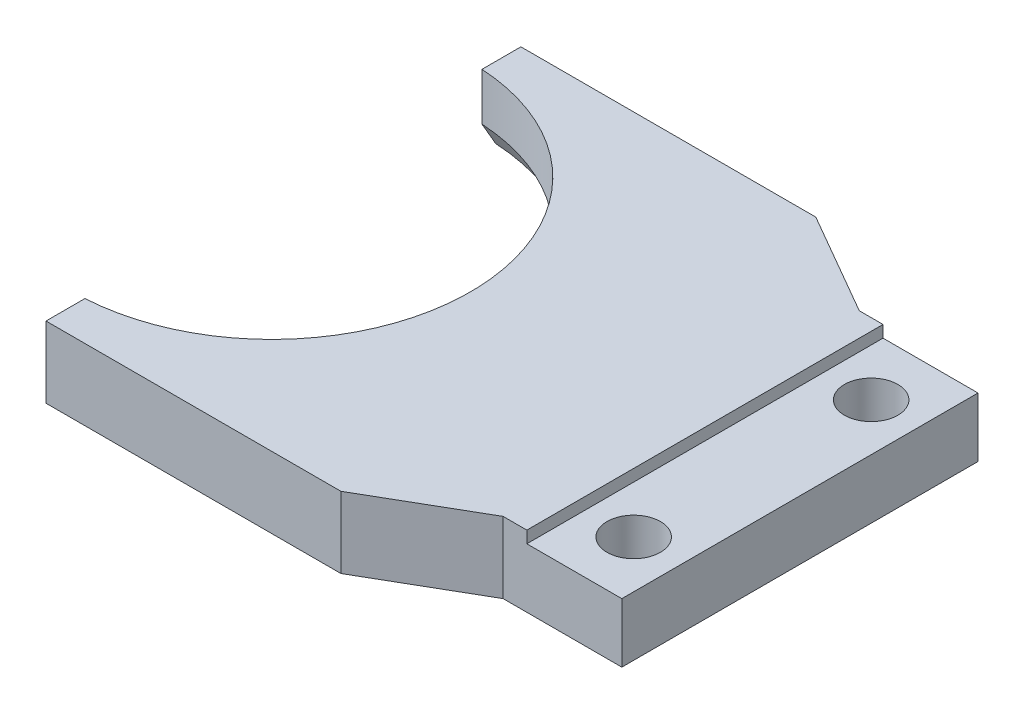
ISO-10303-21;
HEADER;
FILE_DESCRIPTION(('STEP AP214'),'2;1');
FILE_NAME('part.step','',(''),(''),'','','');
FILE_SCHEMA(('AUTOMOTIVE_DESIGN { 1 0 10303 214 1 1 1 1 }'));
ENDSEC;
DATA;
#1=APPLICATION_CONTEXT('core data for automotive mechanical design processes');
#2=APPLICATION_PROTOCOL_DEFINITION('international standard','automotive_design',2000,#1);
#3=PRODUCT_CONTEXT('',#1,'mechanical');
#4=PRODUCT('Part','Part','',(#3));
#5=PRODUCT_RELATED_PRODUCT_CATEGORY('part','',(#4));
#6=PRODUCT_DEFINITION_FORMATION('','',#4);
#7=PRODUCT_DEFINITION_CONTEXT('part definition',#1,'design');
#8=PRODUCT_DEFINITION('design','',#6,#7);
#9=PRODUCT_DEFINITION_SHAPE('','',#8);
#10=(LENGTH_UNIT() NAMED_UNIT(*) SI_UNIT(.MILLI.,.METRE.));
#11=(NAMED_UNIT(*) PLANE_ANGLE_UNIT() SI_UNIT($,.RADIAN.));
#12=(NAMED_UNIT(*) SI_UNIT($,.STERADIAN.) SOLID_ANGLE_UNIT());
#13=UNCERTAINTY_MEASURE_WITH_UNIT(LENGTH_MEASURE(1.E-05),#10,'distance_accuracy_value','');
#14=(GEOMETRIC_REPRESENTATION_CONTEXT(3) GLOBAL_UNCERTAINTY_ASSIGNED_CONTEXT((#13)) GLOBAL_UNIT_ASSIGNED_CONTEXT((#10,
#11,#12)) REPRESENTATION_CONTEXT('',''));
#15=CARTESIAN_POINT('',(0.,0.,0.));
#16=DIRECTION('',(0.,0.,1.));
#17=DIRECTION('',(1.,0.,0.));
#18=AXIS2_PLACEMENT_3D('',#15,#16,#17);
#19=CARTESIAN_POINT('',(0.,0.,0.));
#20=DIRECTION('',(0.,1.,0.));
#21=DIRECTION('',(0.,0.,1.));
#22=AXIS2_PLACEMENT_3D('',#19,#20,#21);
#23=PLANE('',#22);
#24=CARTESIAN_POINT('',(40.5,0.,10.));
#25=DIRECTION('',(0.,1.,0.));
#26=DIRECTION('',(0.,0.,1.));
#27=AXIS2_PLACEMENT_3D('',#24,#25,#26);
#28=CIRCLE('',#27,2.25);
#29=CARTESIAN_POINT('',(40.5,0.,12.25));
#30=VERTEX_POINT('',#29);
#31=EDGE_CURVE('E163',#30,#30,#28,.T.);
#32=ORIENTED_EDGE('',*,*,#31,.T.);
#33=EDGE_LOOP('',(#32));
#34=FACE_BOUND('',#33,.T.);
#35=CARTESIAN_POINT('',(40.5,0.,-10.));
#36=DIRECTION('',(0.,1.,0.));
#37=DIRECTION('',(0.,0.,1.));
#38=AXIS2_PLACEMENT_3D('',#35,#36,#37);
#39=CIRCLE('',#38,2.25);
#40=CARTESIAN_POINT('',(40.5,0.,-7.75));
#41=VERTEX_POINT('',#40);
#42=EDGE_CURVE('E180',#41,#41,#39,.T.);
#43=ORIENTED_EDGE('',*,*,#42,.T.);
#44=EDGE_LOOP('',(#43));
#45=FACE_BOUND('',#44,.T.);
#46=CARTESIAN_POINT('',(0.,0.,0.));
#47=DIRECTION('',(0.,1.,0.));
#48=DIRECTION('',(0.,0.,1.));
#49=AXIS2_PLACEMENT_3D('',#46,#47,#48);
#50=CIRCLE('',#49,17.9047005383792);
#51=CARTESIAN_POINT('',(1.,0.,17.8767530991799));
#52=VERTEX_POINT('',#51);
#53=CARTESIAN_POINT('',(1.,0.,-17.8767530991799));
#54=VERTEX_POINT('',#53);
#55=EDGE_CURVE('E52',#52,#54,#50,.T.);
#56=ORIENTED_EDGE('',*,*,#55,.T.);
#57=DIRECTION('',(0.,0.,1.));
#58=VECTOR('',#57,1.);
#59=CARTESIAN_POINT('',(1.,0.,-16.720122607206));
#60=LINE('',#59,#58);
#61=CARTESIAN_POINT('',(1.,0.,-20.));
#62=VERTEX_POINT('',#61);
#63=EDGE_CURVE('E183',#62,#54,#60,.T.);
#64=ORIENTED_EDGE('',*,*,#63,.F.);
#65=DIRECTION('',(-1.,0.,0.));
#66=VECTOR('',#65,1.);
#67=CARTESIAN_POINT('',(1.,0.,-20.));
#68=LINE('',#67,#66);
#69=CARTESIAN_POINT('',(25.8397459621556,0.,-20.));
#70=VERTEX_POINT('',#69);
#71=EDGE_CURVE('E188',#70,#62,#68,.T.);
#72=ORIENTED_EDGE('',*,*,#71,.F.);
#73=DIRECTION('',(-0.866025403784438,0.,-0.500000000000001));
#74=VECTOR('',#73,1.);
#75=CARTESIAN_POINT('',(25.8397459621556,0.,-20.));
#76=LINE('',#75,#74);
#77=CARTESIAN_POINT('',(34.5,0.,-15.));
#78=VERTEX_POINT('',#77);
#79=EDGE_CURVE('E220',#78,#70,#76,.T.);
#80=ORIENTED_EDGE('',*,*,#79,.F.);
#81=DIRECTION('',(-1.,0.,0.));
#82=VECTOR('',#81,1.);
#83=CARTESIAN_POINT('',(34.5,0.,-15.));
#84=LINE('',#83,#82);
#85=CARTESIAN_POINT('',(44.5,0.,-15.));
#86=VERTEX_POINT('',#85);
#87=EDGE_CURVE('E218',#86,#78,#84,.T.);
#88=ORIENTED_EDGE('',*,*,#87,.F.);
#89=DIRECTION('',(0.,0.,-1.));
#90=VECTOR('',#89,1.);
#91=CARTESIAN_POINT('',(44.5,0.,-15.));
#92=LINE('',#91,#90);
#93=CARTESIAN_POINT('',(44.5,0.,15.));
#94=VERTEX_POINT('',#93);
#95=EDGE_CURVE('E215',#94,#86,#92,.T.);
#96=ORIENTED_EDGE('',*,*,#95,.F.);
#97=DIRECTION('',(1.,0.,0.));
#98=VECTOR('',#97,1.);
#99=CARTESIAN_POINT('',(44.5,0.,15.));
#100=LINE('',#99,#98);
#101=CARTESIAN_POINT('',(34.5,0.,15.));
#102=VERTEX_POINT('',#101);
#103=EDGE_CURVE('E212',#102,#94,#100,.T.);
#104=ORIENTED_EDGE('',*,*,#103,.F.);
#105=DIRECTION('',(0.866025403784438,0.,-0.500000000000001));
#106=VECTOR('',#105,1.);
#107=CARTESIAN_POINT('',(34.5,0.,15.));
#108=LINE('',#107,#106);
#109=CARTESIAN_POINT('',(25.8397459621556,0.,20.));
#110=VERTEX_POINT('',#109);
#111=EDGE_CURVE('E210',#110,#102,#108,.T.);
#112=ORIENTED_EDGE('',*,*,#111,.F.);
#113=DIRECTION('',(1.,0.,0.));
#114=VECTOR('',#113,1.);
#115=CARTESIAN_POINT('',(25.8397459621556,0.,20.));
#116=LINE('',#115,#114);
#117=CARTESIAN_POINT('',(1.,0.,20.));
#118=VERTEX_POINT('',#117);
#119=EDGE_CURVE('E208',#118,#110,#116,.T.);
#120=ORIENTED_EDGE('',*,*,#119,.F.);
#121=DIRECTION('',(0.,0.,1.));
#122=VECTOR('',#121,1.);
#123=CARTESIAN_POINT('',(1.,0.,20.));
#124=LINE('',#123,#122);
#125=EDGE_CURVE('E206',#52,#118,#124,.T.);
#126=ORIENTED_EDGE('',*,*,#125,.F.);
#127=EDGE_LOOP('',(#56,#64,#72,#80,#88,#96,#104,#112,#120,#126));
#128=FACE_BOUND('',#127,.T.);
#129=ADVANCED_FACE('F32',(#34,#45,#128),#23,.F.);
#130=CARTESIAN_POINT('',(1.,6.,-16.720122607206));
#131=DIRECTION('',(1.,0.,0.));
#132=DIRECTION('',(0.,0.,-1.));
#133=AXIS2_PLACEMENT_3D('',#130,#131,#132);
#134=PLANE('',#133);
#135=CARTESIAN_POINT('',(1.,4.24329627778605,-15.4224460160056));
#136=CARTESIAN_POINT('',(1.,3.58672017135782,-15.802314837961));
#137=CARTESIAN_POINT('',(1.,2.93011986582243,-16.1821418279935));
#138=CARTESIAN_POINT('',(1.,1.61687793139749,-16.941724352202));
#139=CARTESIAN_POINT('',(1.,0.960236302508298,-17.3214798863786));
#140=CARTESIAN_POINT('',(1.,-1.00973997376646,-18.4606576268648));
#141=CARTESIAN_POINT('',(1.,-2.32312601006242,-19.2199909707277));
#142=CARTESIAN_POINT('',(1.,-3.63655228702564,-19.9792546757551));
#143=B_SPLINE_CURVE_WITH_KNOTS('',3,(#135,#136,#137,#138,#139,#140,#141,#142),.UNSPECIFIED.,.F.,
.F.,(4,2,2,4),(0.,2.27563892592871,4.55127783317718,9.10255565008902),.UNSPECIFIED.);
#144=CARTESIAN_POINT('',(1.,2.,-16.720122607206));
#145=VERTEX_POINT('',#144);
#146=EDGE_CURVE('E144',#145,#54,#143,.T.);
#147=ORIENTED_EDGE('',*,*,#146,.F.);
#148=DIRECTION('',(0.,-1.,0.));
#149=VECTOR('',#148,1.);
#150=CARTESIAN_POINT('',(1.,6.,-16.720122607206));
#151=LINE('',#150,#149);
#152=CARTESIAN_POINT('',(1.,6.,-16.720122607206));
#153=VERTEX_POINT('',#152);
#154=EDGE_CURVE('E46',#153,#145,#151,.T.);
#155=ORIENTED_EDGE('',*,*,#154,.F.);
#156=DIRECTION('',(0.,0.,1.));
#157=VECTOR('',#156,1.);
#158=CARTESIAN_POINT('',(1.,6.,-16.720122607206));
#159=LINE('',#158,#157);
#160=CARTESIAN_POINT('',(1.,6.,-20.));
#161=VERTEX_POINT('',#160);
#162=EDGE_CURVE('E184',#161,#153,#159,.T.);
#163=ORIENTED_EDGE('',*,*,#162,.F.);
#164=DIRECTION('',(0.,-1.,0.));
#165=VECTOR('',#164,1.);
#166=CARTESIAN_POINT('',(1.,6.,-20.));
#167=LINE('',#166,#165);
#168=EDGE_CURVE('E203',#161,#62,#167,.T.);
#169=ORIENTED_EDGE('',*,*,#168,.T.);
#170=ORIENTED_EDGE('',*,*,#63,.T.);
#171=EDGE_LOOP('',(#147,#155,#163,#169,#170));
#172=FACE_BOUND('',#171,.T.);
#173=ADVANCED_FACE('F34',(#172),#134,.F.);
#174=CARTESIAN_POINT('',(0.,6.,0.));
#175=DIRECTION('',(0.,-1.,0.));
#176=DIRECTION('',(0.,0.,-1.));
#177=AXIS2_PLACEMENT_3D('',#174,#175,#176);
#178=CYLINDRICAL_SURFACE('',#177,16.75);
#179=CARTESIAN_POINT('',(0.,2.,0.));
#180=DIRECTION('',(0.,1.,0.));
#181=DIRECTION('',(0.,0.,1.));
#182=AXIS2_PLACEMENT_3D('',#179,#180,#181);
#183=CIRCLE('',#182,16.75);
#184=CARTESIAN_POINT('',(1.,2.,16.720122607206));
#185=VERTEX_POINT('',#184);
#186=EDGE_CURVE('E132',#185,#145,#183,.T.);
#187=ORIENTED_EDGE('',*,*,#186,.F.);
#188=DIRECTION('',(0.,-1.,0.));
#189=VECTOR('',#188,1.);
#190=CARTESIAN_POINT('',(1.,6.,16.720122607206));
#191=LINE('',#190,#189);
#192=CARTESIAN_POINT('',(1.,6.,16.720122607206));
#193=VERTEX_POINT('',#192);
#194=EDGE_CURVE('E141',#193,#185,#191,.T.);
#195=ORIENTED_EDGE('',*,*,#194,.F.);
#196=CARTESIAN_POINT('',(0.,6.,0.));
#197=DIRECTION('',(0.,-1.,0.));
#198=DIRECTION('',(0.,0.,1.));
#199=AXIS2_PLACEMENT_3D('',#196,#197,#198);
#200=CIRCLE('',#199,16.75);
#201=EDGE_CURVE('E187',#153,#193,#200,.T.);
#202=ORIENTED_EDGE('',*,*,#201,.F.);
#203=ORIENTED_EDGE('',*,*,#154,.T.);
#204=EDGE_LOOP('',(#187,#195,#202,#203));
#205=FACE_BOUND('',#204,.T.);
#206=ADVANCED_FACE('F140',(#205),#178,.F.);
#207=CARTESIAN_POINT('',(1.,6.,20.));
#208=DIRECTION('',(1.,0.,0.));
#209=DIRECTION('',(0.,0.,-1.));
#210=AXIS2_PLACEMENT_3D('',#207,#208,#209);
#211=PLANE('',#210);
#212=CARTESIAN_POINT('',(1.,-3.00511060718146,19.614226799327));
#213=CARTESIAN_POINT('',(1.,-2.34840377960703,19.234584016654));
#214=CARTESIAN_POINT('',(1.,-1.69170892399129,18.854920523265));
#215=CARTESIAN_POINT('',(1.,-0.378348963562122,18.095542096251));
#216=CARTESIAN_POINT('',(1.,0.278316141251572,17.7158271626265));
#217=CARTESIAN_POINT('',(1.,1.59161080756625,16.9563358280282));
#218=CARTESIAN_POINT('',(1.,2.24824036906711,16.576559427054));
#219=CARTESIAN_POINT('',(1.,3.56145530081885,15.8169302156888));
#220=CARTESIAN_POINT('',(1.,4.21804067106932,15.4370774052971));
#221=CARTESIAN_POINT('',(1.,4.87459961670086,15.0571789220692));
#222=B_SPLINE_CURVE_WITH_KNOTS('',3,(#212,#213,#214,#215,#216,#217,#218,#219,#220,#221),
.UNSPECIFIED.,.F.,.F.,(4,2,2,2,4),(0.,2.27563892165671,4.55127782219843,6.82691673032132,
9.10255565965005),.UNSPECIFIED.);
#223=EDGE_CURVE('E11',#52,#185,#222,.T.);
#224=ORIENTED_EDGE('',*,*,#223,.F.);
#225=ORIENTED_EDGE('',*,*,#125,.T.);
#226=DIRECTION('',(0.,-1.,0.));
#227=VECTOR('',#226,1.);
#228=CARTESIAN_POINT('',(1.,6.,20.));
#229=LINE('',#228,#227);
#230=CARTESIAN_POINT('',(1.,6.,20.));
#231=VERTEX_POINT('',#230);
#232=EDGE_CURVE('E149',#231,#118,#229,.T.);
#233=ORIENTED_EDGE('',*,*,#232,.F.);
#234=DIRECTION('',(0.,0.,1.));
#235=VECTOR('',#234,1.);
#236=CARTESIAN_POINT('',(1.,6.,20.));
#237=LINE('',#236,#235);
#238=EDGE_CURVE('E148',#193,#231,#237,.T.);
#239=ORIENTED_EDGE('',*,*,#238,.F.);
#240=ORIENTED_EDGE('',*,*,#194,.T.);
#241=EDGE_LOOP('',(#224,#225,#233,#239,#240));
#242=FACE_BOUND('',#241,.T.);
#243=ADVANCED_FACE('F146',(#242),#211,.F.);
#244=CARTESIAN_POINT('',(0.,6.,0.));
#245=DIRECTION('',(0.,1.,0.));
#246=DIRECTION('',(0.,0.,1.));
#247=AXIS2_PLACEMENT_3D('',#244,#245,#246);
#248=PLANE('',#247);
#249=DIRECTION('',(0.,0.,1.));
#250=VECTOR('',#249,1.);
#251=CARTESIAN_POINT('',(36.5,6.,-15.));
#252=LINE('',#251,#250);
#253=CARTESIAN_POINT('',(36.5,6.,-15.));
#254=VERTEX_POINT('',#253);
#255=CARTESIAN_POINT('',(36.5,6.,15.));
#256=VERTEX_POINT('',#255);
#257=EDGE_CURVE('E175',#254,#256,#252,.T.);
#258=ORIENTED_EDGE('',*,*,#257,.F.);
#259=DIRECTION('',(-1.,0.,0.));
#260=VECTOR('',#259,1.);
#261=CARTESIAN_POINT('',(34.5,6.,-15.));
#262=LINE('',#261,#260);
#263=CARTESIAN_POINT('',(34.5,6.,-15.));
#264=VERTEX_POINT('',#263);
#265=EDGE_CURVE('E197',#254,#264,#262,.T.);
#266=ORIENTED_EDGE('',*,*,#265,.T.);
#267=DIRECTION('',(-0.866025403784438,0.,-0.500000000000001));
#268=VECTOR('',#267,1.);
#269=CARTESIAN_POINT('',(25.8397459621556,6.,-20.));
#270=LINE('',#269,#268);
#271=CARTESIAN_POINT('',(25.8397459621556,6.,-20.));
#272=VERTEX_POINT('',#271);
#273=EDGE_CURVE('E199',#264,#272,#270,.T.);
#274=ORIENTED_EDGE('',*,*,#273,.T.);
#275=DIRECTION('',(-1.,0.,0.));
#276=VECTOR('',#275,1.);
#277=CARTESIAN_POINT('',(1.,6.,-20.));
#278=LINE('',#277,#276);
#279=EDGE_CURVE('E201',#272,#161,#278,.T.);
#280=ORIENTED_EDGE('',*,*,#279,.T.);
#281=ORIENTED_EDGE('',*,*,#162,.T.);
#282=ORIENTED_EDGE('',*,*,#201,.T.);
#283=ORIENTED_EDGE('',*,*,#238,.T.);
#284=DIRECTION('',(1.,0.,0.));
#285=VECTOR('',#284,1.);
#286=CARTESIAN_POINT('',(25.8397459621556,6.,20.));
#287=LINE('',#286,#285);
#288=CARTESIAN_POINT('',(25.8397459621556,6.,20.));
#289=VERTEX_POINT('',#288);
#290=EDGE_CURVE('E191',#231,#289,#287,.T.);
#291=ORIENTED_EDGE('',*,*,#290,.T.);
#292=DIRECTION('',(0.866025403784438,0.,-0.500000000000001));
#293=VECTOR('',#292,1.);
#294=CARTESIAN_POINT('',(34.5,6.,15.));
#295=LINE('',#294,#293);
#296=CARTESIAN_POINT('',(34.5,6.,15.));
#297=VERTEX_POINT('',#296);
#298=EDGE_CURVE('E193',#289,#297,#295,.T.);
#299=ORIENTED_EDGE('',*,*,#298,.T.);
#300=DIRECTION('',(1.,0.,0.));
#301=VECTOR('',#300,1.);
#302=CARTESIAN_POINT('',(44.5,6.,15.));
#303=LINE('',#302,#301);
#304=EDGE_CURVE('E195',#297,#256,#303,.T.);
#305=ORIENTED_EDGE('',*,*,#304,.T.);
#306=EDGE_LOOP('',(#258,#266,#274,#280,#281,#282,#283,#291,#299,#305));
#307=FACE_BOUND('',#306,.T.);
#308=ADVANCED_FACE('F255',(#307),#248,.T.);
#309=CARTESIAN_POINT('',(25.8397459621556,6.,20.));
#310=DIRECTION('',(0.,0.,-1.));
#311=DIRECTION('',(-1.,0.,0.));
#312=AXIS2_PLACEMENT_3D('',#309,#310,#311);
#313=PLANE('',#312);
#314=ORIENTED_EDGE('',*,*,#119,.T.);
#315=DIRECTION('',(0.,-1.,0.));
#316=VECTOR('',#315,1.);
#317=CARTESIAN_POINT('',(25.8397459621556,6.,20.));
#318=LINE('',#317,#316);
#319=EDGE_CURVE('E153',#289,#110,#318,.T.);
#320=ORIENTED_EDGE('',*,*,#319,.F.);
#321=ORIENTED_EDGE('',*,*,#290,.F.);
#322=ORIENTED_EDGE('',*,*,#232,.T.);
#323=EDGE_LOOP('',(#314,#320,#321,#322));
#324=FACE_BOUND('',#323,.T.);
#325=ADVANCED_FACE('F257',(#324),#313,.F.);
#326=CARTESIAN_POINT('',(34.5,6.,15.));
#327=DIRECTION('',(-0.500000000000001,0.,-0.866025403784438));
#328=DIRECTION('',(-0.866025403784438,0.,0.500000000000001));
#329=AXIS2_PLACEMENT_3D('',#326,#327,#328);
#330=PLANE('',#329);
#331=ORIENTED_EDGE('',*,*,#111,.T.);
#332=DIRECTION('',(0.,-1.,0.));
#333=VECTOR('',#332,1.);
#334=CARTESIAN_POINT('',(34.5,6.,15.));
#335=LINE('',#334,#333);
#336=EDGE_CURVE('E235',#297,#102,#335,.T.);
#337=ORIENTED_EDGE('',*,*,#336,.F.);
#338=ORIENTED_EDGE('',*,*,#298,.F.);
#339=ORIENTED_EDGE('',*,*,#319,.T.);
#340=EDGE_LOOP('',(#331,#337,#338,#339));
#341=FACE_BOUND('',#340,.T.);
#342=ADVANCED_FACE('F242',(#341),#330,.F.);
#343=CARTESIAN_POINT('',(44.5,6.,15.));
#344=DIRECTION('',(0.,0.,-1.));
#345=DIRECTION('',(-1.,0.,0.));
#346=AXIS2_PLACEMENT_3D('',#343,#344,#345);
#347=PLANE('',#346);
#348=DIRECTION('',(1.,0.,0.));
#349=VECTOR('',#348,1.);
#350=CARTESIAN_POINT('',(44.5,5.,15.));
#351=LINE('',#350,#349);
#352=CARTESIAN_POINT('',(36.5,5.,15.));
#353=VERTEX_POINT('',#352);
#354=CARTESIAN_POINT('',(44.5,5.,15.));
#355=VERTEX_POINT('',#354);
#356=EDGE_CURVE('E172',#353,#355,#351,.T.);
#357=ORIENTED_EDGE('',*,*,#356,.F.);
#358=DIRECTION('',(0.,1.,0.));
#359=VECTOR('',#358,1.);
#360=CARTESIAN_POINT('',(36.5,5.,15.));
#361=LINE('',#360,#359);
#362=EDGE_CURVE('E159',#353,#256,#361,.T.);
#363=ORIENTED_EDGE('',*,*,#362,.T.);
#364=ORIENTED_EDGE('',*,*,#304,.F.);
#365=ORIENTED_EDGE('',*,*,#336,.T.);
#366=ORIENTED_EDGE('',*,*,#103,.T.);
#367=DIRECTION('',(0.,-1.,0.));
#368=VECTOR('',#367,1.);
#369=CARTESIAN_POINT('',(44.5,6.,15.));
#370=LINE('',#369,#368);
#371=EDGE_CURVE('E233',#355,#94,#370,.T.);
#372=ORIENTED_EDGE('',*,*,#371,.F.);
#373=EDGE_LOOP('',(#357,#363,#364,#365,#366,#372));
#374=FACE_BOUND('',#373,.T.);
#375=ADVANCED_FACE('F252',(#374),#347,.F.);
#376=CARTESIAN_POINT('',(44.5,6.,-15.));
#377=DIRECTION('',(-1.,0.,0.));
#378=DIRECTION('',(0.,0.,1.));
#379=AXIS2_PLACEMENT_3D('',#376,#377,#378);
#380=PLANE('',#379);
#381=DIRECTION('',(0.,-1.,0.));
#382=VECTOR('',#381,1.);
#383=CARTESIAN_POINT('',(44.5,6.,-15.));
#384=LINE('',#383,#382);
#385=CARTESIAN_POINT('',(44.5,5.,-15.));
#386=VERTEX_POINT('',#385);
#387=EDGE_CURVE('E231',#386,#86,#384,.T.);
#388=ORIENTED_EDGE('',*,*,#387,.F.);
#389=DIRECTION('',(0.,0.,-1.));
#390=VECTOR('',#389,1.);
#391=CARTESIAN_POINT('',(44.5,5.,-15.));
#392=LINE('',#391,#390);
#393=EDGE_CURVE('E60',#355,#386,#392,.T.);
#394=ORIENTED_EDGE('',*,*,#393,.F.);
#395=ORIENTED_EDGE('',*,*,#371,.T.);
#396=ORIENTED_EDGE('',*,*,#95,.T.);
#397=EDGE_LOOP('',(#388,#394,#395,#396));
#398=FACE_BOUND('',#397,.T.);
#399=ADVANCED_FACE('F279',(#398),#380,.F.);
#400=CARTESIAN_POINT('',(34.5,6.,-15.));
#401=DIRECTION('',(0.,0.,1.));
#402=DIRECTION('',(1.,0.,0.));
#403=AXIS2_PLACEMENT_3D('',#400,#401,#402);
#404=PLANE('',#403);
#405=ORIENTED_EDGE('',*,*,#265,.F.);
#406=DIRECTION('',(0.,1.,0.));
#407=VECTOR('',#406,1.);
#408=CARTESIAN_POINT('',(36.5,5.,-15.));
#409=LINE('',#408,#407);
#410=CARTESIAN_POINT('',(36.5,5.,-15.));
#411=VERTEX_POINT('',#410);
#412=EDGE_CURVE('E166',#411,#254,#409,.T.);
#413=ORIENTED_EDGE('',*,*,#412,.F.);
#414=DIRECTION('',(-1.,0.,0.));
#415=VECTOR('',#414,1.);
#416=CARTESIAN_POINT('',(44.5,5.,-15.));
#417=LINE('',#416,#415);
#418=EDGE_CURVE('E277',#386,#411,#417,.T.);
#419=ORIENTED_EDGE('',*,*,#418,.F.);
#420=ORIENTED_EDGE('',*,*,#387,.T.);
#421=ORIENTED_EDGE('',*,*,#87,.T.);
#422=DIRECTION('',(0.,-1.,0.));
#423=VECTOR('',#422,1.);
#424=CARTESIAN_POINT('',(34.5,6.,-15.));
#425=LINE('',#424,#423);
#426=EDGE_CURVE('E228',#264,#78,#425,.T.);
#427=ORIENTED_EDGE('',*,*,#426,.F.);
#428=EDGE_LOOP('',(#405,#413,#419,#420,#421,#427));
#429=FACE_BOUND('',#428,.T.);
#430=ADVANCED_FACE('F274',(#429),#404,.F.);
#431=CARTESIAN_POINT('',(25.8397459621556,6.,-20.));
#432=DIRECTION('',(-0.500000000000001,0.,0.866025403784438));
#433=DIRECTION('',(0.866025403784438,0.,0.500000000000001));
#434=AXIS2_PLACEMENT_3D('',#431,#432,#433);
#435=PLANE('',#434);
#436=ORIENTED_EDGE('',*,*,#79,.T.);
#437=DIRECTION('',(0.,-1.,0.));
#438=VECTOR('',#437,1.);
#439=CARTESIAN_POINT('',(25.8397459621556,6.,-20.));
#440=LINE('',#439,#438);
#441=EDGE_CURVE('E225',#272,#70,#440,.T.);
#442=ORIENTED_EDGE('',*,*,#441,.F.);
#443=ORIENTED_EDGE('',*,*,#273,.F.);
#444=ORIENTED_EDGE('',*,*,#426,.T.);
#445=EDGE_LOOP('',(#436,#442,#443,#444));
#446=FACE_BOUND('',#445,.T.);
#447=ADVANCED_FACE('F270',(#446),#435,.F.);
#448=CARTESIAN_POINT('',(1.,6.,-20.));
#449=DIRECTION('',(0.,0.,1.));
#450=DIRECTION('',(1.,0.,0.));
#451=AXIS2_PLACEMENT_3D('',#448,#449,#450);
#452=PLANE('',#451);
#453=ORIENTED_EDGE('',*,*,#71,.T.);
#454=ORIENTED_EDGE('',*,*,#168,.F.);
#455=ORIENTED_EDGE('',*,*,#279,.F.);
#456=ORIENTED_EDGE('',*,*,#441,.T.);
#457=EDGE_LOOP('',(#453,#454,#455,#456));
#458=FACE_BOUND('',#457,.T.);
#459=ADVANCED_FACE('F266',(#458),#452,.F.);
#460=CARTESIAN_POINT('',(40.5,6.,-10.));
#461=DIRECTION('',(0.,-1.,0.));
#462=DIRECTION('',(0.,0.,-1.));
#463=AXIS2_PLACEMENT_3D('',#460,#461,#462);
#464=CYLINDRICAL_SURFACE('',#463,2.25);
#465=CARTESIAN_POINT('',(40.5,5.,-10.));
#466=DIRECTION('',(0.,-1.,0.));
#467=DIRECTION('',(0.,0.,-1.));
#468=AXIS2_PLACEMENT_3D('',#465,#466,#467);
#469=CIRCLE('',#468,2.25);
#470=CARTESIAN_POINT('',(40.5,5.,-12.25));
#471=VERTEX_POINT('',#470);
#472=EDGE_CURVE('E158',#471,#471,#469,.T.);
#473=ORIENTED_EDGE('',*,*,#472,.F.);
#474=EDGE_LOOP('',(#473));
#475=FACE_BOUND('',#474,.T.);
#476=ORIENTED_EDGE('',*,*,#42,.F.);
#477=EDGE_LOOP('',(#476));
#478=FACE_BOUND('',#477,.T.);
#479=ADVANCED_FACE('F301',(#475,#478),#464,.F.);
#480=CARTESIAN_POINT('',(40.5,6.,10.));
#481=DIRECTION('',(0.,-1.,0.));
#482=DIRECTION('',(0.,0.,-1.));
#483=AXIS2_PLACEMENT_3D('',#480,#481,#482);
#484=CYLINDRICAL_SURFACE('',#483,2.25);
#485=CARTESIAN_POINT('',(40.5,5.,10.));
#486=DIRECTION('',(0.,-1.,0.));
#487=DIRECTION('',(0.,0.,-1.));
#488=AXIS2_PLACEMENT_3D('',#485,#486,#487);
#489=CIRCLE('',#488,2.25);
#490=CARTESIAN_POINT('',(40.5,5.,7.75));
#491=VERTEX_POINT('',#490);
#492=EDGE_CURVE('E156',#491,#491,#489,.T.);
#493=ORIENTED_EDGE('',*,*,#492,.F.);
#494=EDGE_LOOP('',(#493));
#495=FACE_BOUND('',#494,.T.);
#496=ORIENTED_EDGE('',*,*,#31,.F.);
#497=EDGE_LOOP('',(#496));
#498=FACE_BOUND('',#497,.T.);
#499=ADVANCED_FACE('F293',(#495,#498),#484,.F.);
#500=CARTESIAN_POINT('',(36.5,5.,-15.));
#501=DIRECTION('',(-1.,0.,0.));
#502=DIRECTION('',(0.,0.,1.));
#503=AXIS2_PLACEMENT_3D('',#500,#501,#502);
#504=PLANE('',#503);
#505=ORIENTED_EDGE('',*,*,#257,.T.);
#506=ORIENTED_EDGE('',*,*,#362,.F.);
#507=DIRECTION('',(0.,0.,1.));
#508=VECTOR('',#507,1.);
#509=CARTESIAN_POINT('',(36.5,5.,-15.));
#510=LINE('',#509,#508);
#511=EDGE_CURVE('E281',#411,#353,#510,.T.);
#512=ORIENTED_EDGE('',*,*,#511,.F.);
#513=ORIENTED_EDGE('',*,*,#412,.T.);
#514=EDGE_LOOP('',(#505,#506,#512,#513));
#515=FACE_BOUND('',#514,.T.);
#516=ADVANCED_FACE('F291',(#515),#504,.F.);
#517=CARTESIAN_POINT('',(0.,5.,0.));
#518=DIRECTION('',(0.,-1.,0.));
#519=DIRECTION('',(0.,0.,-1.));
#520=AXIS2_PLACEMENT_3D('',#517,#518,#519);
#521=PLANE('',#520);
#522=ORIENTED_EDGE('',*,*,#472,.T.);
#523=EDGE_LOOP('',(#522));
#524=FACE_BOUND('',#523,.T.);
#525=ORIENTED_EDGE('',*,*,#492,.T.);
#526=EDGE_LOOP('',(#525));
#527=FACE_BOUND('',#526,.T.);
#528=ORIENTED_EDGE('',*,*,#393,.T.);
#529=ORIENTED_EDGE('',*,*,#418,.T.);
#530=ORIENTED_EDGE('',*,*,#511,.T.);
#531=ORIENTED_EDGE('',*,*,#356,.T.);
#532=EDGE_LOOP('',(#528,#529,#530,#531));
#533=FACE_BOUND('',#532,.T.);
#534=ADVANCED_FACE('F289',(#524,#527,#533),#521,.F.);
#535=CARTESIAN_POINT('',(0.,0.,0.));
#536=DIRECTION('',(0.,-1.,0.));
#537=DIRECTION('',(0.,0.,-1.));
#538=AXIS2_PLACEMENT_3D('',#535,#536,#537);
#539=CONICAL_SURFACE('',#538,17.9047005383792,0.523598775598293);
#540=ORIENTED_EDGE('',*,*,#146,.T.);
#541=ORIENTED_EDGE('',*,*,#55,.F.);
#542=ORIENTED_EDGE('',*,*,#223,.T.);
#543=ORIENTED_EDGE('',*,*,#186,.T.);
#544=EDGE_LOOP('',(#540,#541,#542,#543));
#545=FACE_BOUND('',#544,.T.);
#546=ADVANCED_FACE('F131',(#545),#539,.F.);
#547=CLOSED_SHELL('',(#129,#173,#206,#243,#308,#325,#342,#375,#399,#430,#447,#459,#479,#499,
#516,#534,#546));
#548=MANIFOLD_SOLID_BREP('B2',#547);
#549=ADVANCED_BREP_SHAPE_REPRESENTATION('',(#18,#548),#14);
#550=SHAPE_DEFINITION_REPRESENTATION(#9,#549);
ENDSEC;
END-ISO-10303-21;
